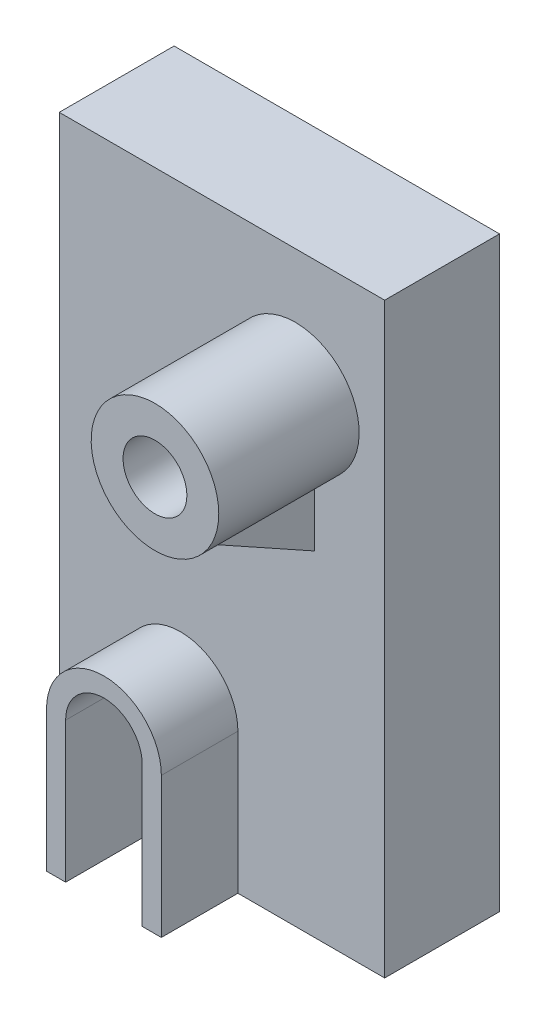
ISO-10303-21;
HEADER;
FILE_DESCRIPTION(('STEP AP214'),'2;1');
FILE_NAME('part.step','',(''),(''),'','','');
FILE_SCHEMA(('AUTOMOTIVE_DESIGN { 1 0 10303 214 1 1 1 1 }'));
ENDSEC;
DATA;
#1=APPLICATION_CONTEXT('core data for automotive mechanical design processes');
#2=APPLICATION_PROTOCOL_DEFINITION('international standard','automotive_design',2000,#1);
#3=PRODUCT_CONTEXT('',#1,'mechanical');
#4=PRODUCT('Part','Part','',(#3));
#5=PRODUCT_RELATED_PRODUCT_CATEGORY('part','',(#4));
#6=PRODUCT_DEFINITION_FORMATION('','',#4);
#7=PRODUCT_DEFINITION_CONTEXT('part definition',#1,'design');
#8=PRODUCT_DEFINITION('design','',#6,#7);
#9=PRODUCT_DEFINITION_SHAPE('','',#8);
#10=(LENGTH_UNIT() NAMED_UNIT(*) SI_UNIT(.MILLI.,.METRE.));
#11=(NAMED_UNIT(*) PLANE_ANGLE_UNIT() SI_UNIT($,.RADIAN.));
#12=(NAMED_UNIT(*) SI_UNIT($,.STERADIAN.) SOLID_ANGLE_UNIT());
#13=UNCERTAINTY_MEASURE_WITH_UNIT(LENGTH_MEASURE(1.E-05),#10,'distance_accuracy_value','');
#14=(GEOMETRIC_REPRESENTATION_CONTEXT(3) GLOBAL_UNCERTAINTY_ASSIGNED_CONTEXT((#13)) GLOBAL_UNIT_ASSIGNED_CONTEXT((#10,
#11,#12)) REPRESENTATION_CONTEXT('',''));
#15=CARTESIAN_POINT('',(0.,0.,0.));
#16=DIRECTION('',(0.,0.,1.));
#17=DIRECTION('',(1.,0.,0.));
#18=AXIS2_PLACEMENT_3D('',#15,#16,#17);
#19=CARTESIAN_POINT('',(0.,0.,18.));
#20=DIRECTION('',(0.,1.,0.));
#21=DIRECTION('',(0.,0.,1.));
#22=AXIS2_PLACEMENT_3D('',#19,#20,#21);
#23=PLANE('',#22);
#24=DIRECTION('',(1.,0.,0.));
#25=VECTOR('',#24,1.);
#26=CARTESIAN_POINT('',(0.,0.,0.));
#27=LINE('',#26,#25);
#28=CARTESIAN_POINT('',(25.,0.,0.));
#29=VERTEX_POINT('',#28);
#30=CARTESIAN_POINT('',(51.,0.,0.));
#31=VERTEX_POINT('',#30);
#32=EDGE_CURVE('E126',#29,#31,#27,.T.);
#33=ORIENTED_EDGE('',*,*,#32,.T.);
#34=DIRECTION('',(0.,0.,-1.));
#35=VECTOR('',#34,1.);
#36=CARTESIAN_POINT('',(51.,0.,18.));
#37=LINE('',#36,#35);
#38=CARTESIAN_POINT('',(51.,0.,18.));
#39=VERTEX_POINT('',#38);
#40=EDGE_CURVE('E11',#39,#31,#37,.T.);
#41=ORIENTED_EDGE('',*,*,#40,.F.);
#42=DIRECTION('',(1.,0.,0.));
#43=VECTOR('',#42,1.);
#44=CARTESIAN_POINT('',(0.,0.,18.));
#45=LINE('',#44,#43);
#46=CARTESIAN_POINT('',(28.,0.,18.));
#47=VERTEX_POINT('',#46);
#48=EDGE_CURVE('E195',#47,#39,#45,.T.);
#49=ORIENTED_EDGE('',*,*,#48,.F.);
#50=DIRECTION('',(0.,0.,-1.));
#51=VECTOR('',#50,1.);
#52=CARTESIAN_POINT('',(28.,0.,30.));
#53=LINE('',#52,#51);
#54=CARTESIAN_POINT('',(28.,0.,30.));
#55=VERTEX_POINT('',#54);
#56=EDGE_CURVE('E307',#55,#47,#53,.T.);
#57=ORIENTED_EDGE('',*,*,#56,.F.);
#58=DIRECTION('',(1.,0.,0.));
#59=VECTOR('',#58,1.);
#60=CARTESIAN_POINT('',(0.,0.,30.));
#61=LINE('',#60,#59);
#62=CARTESIAN_POINT('',(25.,0.,30.));
#63=VERTEX_POINT('',#62);
#64=EDGE_CURVE('E305',#63,#55,#61,.T.);
#65=ORIENTED_EDGE('',*,*,#64,.F.);
#66=DIRECTION('',(0.,0.,-1.));
#67=VECTOR('',#66,1.);
#68=CARTESIAN_POINT('',(25.,0.,30.));
#69=LINE('',#68,#67);
#70=EDGE_CURVE('E203',#63,#29,#69,.T.);
#71=ORIENTED_EDGE('',*,*,#70,.T.);
#72=EDGE_LOOP('',(#33,#41,#49,#57,#65,#71));
#73=FACE_BOUND('',#72,.T.);
#74=ADVANCED_FACE('F41',(#73),#23,.F.);
#75=CARTESIAN_POINT('',(51.,0.,18.));
#76=DIRECTION('',(-1.,0.,0.));
#77=DIRECTION('',(0.,0.,1.));
#78=AXIS2_PLACEMENT_3D('',#75,#76,#77);
#79=PLANE('',#78);
#80=DIRECTION('',(0.,1.,0.));
#81=VECTOR('',#80,1.);
#82=CARTESIAN_POINT('',(51.,0.,0.));
#83=LINE('',#82,#81);
#84=CARTESIAN_POINT('',(51.,92.,0.));
#85=VERTEX_POINT('',#84);
#86=EDGE_CURVE('E129',#31,#85,#83,.T.);
#87=ORIENTED_EDGE('',*,*,#86,.T.);
#88=DIRECTION('',(0.,0.,-1.));
#89=VECTOR('',#88,1.);
#90=CARTESIAN_POINT('',(51.,92.,18.));
#91=LINE('',#90,#89);
#92=CARTESIAN_POINT('',(51.,92.,18.));
#93=VERTEX_POINT('',#92);
#94=EDGE_CURVE('E49',#93,#85,#91,.T.);
#95=ORIENTED_EDGE('',*,*,#94,.F.);
#96=DIRECTION('',(0.,1.,0.));
#97=VECTOR('',#96,1.);
#98=CARTESIAN_POINT('',(51.,0.,18.));
#99=LINE('',#98,#97);
#100=EDGE_CURVE('E121',#39,#93,#99,.T.);
#101=ORIENTED_EDGE('',*,*,#100,.F.);
#102=ORIENTED_EDGE('',*,*,#40,.T.);
#103=EDGE_LOOP('',(#87,#95,#101,#102));
#104=FACE_BOUND('',#103,.T.);
#105=ADVANCED_FACE('F144',(#104),#79,.F.);
#106=CARTESIAN_POINT('',(0.,92.,18.));
#107=DIRECTION('',(0.,1.,0.));
#108=DIRECTION('',(0.,0.,1.));
#109=AXIS2_PLACEMENT_3D('',#106,#107,#108);
#110=PLANE('',#109);
#111=DIRECTION('',(1.,0.,0.));
#112=VECTOR('',#111,1.);
#113=CARTESIAN_POINT('',(0.,92.,0.));
#114=LINE('',#113,#112);
#115=CARTESIAN_POINT('',(0.,92.,0.));
#116=VERTEX_POINT('',#115);
#117=EDGE_CURVE('E133',#116,#85,#114,.T.);
#118=ORIENTED_EDGE('',*,*,#117,.F.);
#119=DIRECTION('',(0.,0.,-1.));
#120=VECTOR('',#119,1.);
#121=CARTESIAN_POINT('',(0.,92.,18.));
#122=LINE('',#121,#120);
#123=CARTESIAN_POINT('',(0.,92.,18.));
#124=VERTEX_POINT('',#123);
#125=EDGE_CURVE('E75',#124,#116,#122,.T.);
#126=ORIENTED_EDGE('',*,*,#125,.F.);
#127=DIRECTION('',(1.,0.,0.));
#128=VECTOR('',#127,1.);
#129=CARTESIAN_POINT('',(0.,92.,18.));
#130=LINE('',#129,#128);
#131=EDGE_CURVE('E119',#124,#93,#130,.T.);
#132=ORIENTED_EDGE('',*,*,#131,.T.);
#133=ORIENTED_EDGE('',*,*,#94,.T.);
#134=EDGE_LOOP('',(#118,#126,#132,#133));
#135=FACE_BOUND('',#134,.T.);
#136=ADVANCED_FACE('F142',(#135),#110,.T.);
#137=CARTESIAN_POINT('',(0.,0.,18.));
#138=DIRECTION('',(-1.,0.,0.));
#139=DIRECTION('',(0.,0.,1.));
#140=AXIS2_PLACEMENT_3D('',#137,#138,#139);
#141=PLANE('',#140);
#142=DIRECTION('',(0.,1.,0.));
#143=VECTOR('',#142,1.);
#144=CARTESIAN_POINT('',(0.,0.,0.));
#145=LINE('',#144,#143);
#146=CARTESIAN_POINT('',(0.,0.,0.));
#147=VERTEX_POINT('',#146);
#148=EDGE_CURVE('E107',#147,#116,#145,.T.);
#149=ORIENTED_EDGE('',*,*,#148,.F.);
#150=DIRECTION('',(0.,0.,-1.));
#151=VECTOR('',#150,1.);
#152=CARTESIAN_POINT('',(0.,0.,18.));
#153=LINE('',#152,#151);
#154=CARTESIAN_POINT('',(0.,0.,18.));
#155=VERTEX_POINT('',#154);
#156=EDGE_CURVE('E83',#155,#147,#153,.T.);
#157=ORIENTED_EDGE('',*,*,#156,.F.);
#158=DIRECTION('',(0.,1.,0.));
#159=VECTOR('',#158,1.);
#160=CARTESIAN_POINT('',(0.,0.,18.));
#161=LINE('',#160,#159);
#162=EDGE_CURVE('E105',#155,#124,#161,.T.);
#163=ORIENTED_EDGE('',*,*,#162,.T.);
#164=ORIENTED_EDGE('',*,*,#125,.T.);
#165=EDGE_LOOP('',(#149,#157,#163,#164));
#166=FACE_BOUND('',#165,.T.);
#167=ADVANCED_FACE('F103',(#166),#141,.T.);
#168=CARTESIAN_POINT('',(0.,0.,18.));
#169=DIRECTION('',(0.,1.,0.));
#170=DIRECTION('',(0.,0.,1.));
#171=AXIS2_PLACEMENT_3D('',#168,#169,#170);
#172=PLANE('',#171);
#173=DIRECTION('',(1.,0.,0.));
#174=VECTOR('',#173,1.);
#175=CARTESIAN_POINT('',(0.,0.,0.));
#176=LINE('',#175,#174);
#177=CARTESIAN_POINT('',(13.,0.,0.));
#178=VERTEX_POINT('',#177);
#179=EDGE_CURVE('E137',#147,#178,#176,.T.);
#180=ORIENTED_EDGE('',*,*,#179,.T.);
#181=DIRECTION('',(0.,0.,-1.));
#182=VECTOR('',#181,1.);
#183=CARTESIAN_POINT('',(13.,0.,30.));
#184=LINE('',#183,#182);
#185=CARTESIAN_POINT('',(13.,0.,30.));
#186=VERTEX_POINT('',#185);
#187=EDGE_CURVE('E158',#186,#178,#184,.T.);
#188=ORIENTED_EDGE('',*,*,#187,.F.);
#189=DIRECTION('',(1.,0.,0.));
#190=VECTOR('',#189,1.);
#191=CARTESIAN_POINT('',(0.,0.,30.));
#192=LINE('',#191,#190);
#193=CARTESIAN_POINT('',(9.99999999999999,0.,30.));
#194=VERTEX_POINT('',#193);
#195=EDGE_CURVE('E297',#194,#186,#192,.T.);
#196=ORIENTED_EDGE('',*,*,#195,.F.);
#197=DIRECTION('',(0.,0.,-1.));
#198=VECTOR('',#197,1.);
#199=CARTESIAN_POINT('',(9.99999999999999,0.,30.));
#200=LINE('',#199,#198);
#201=CARTESIAN_POINT('',(9.99999999999999,0.,18.));
#202=VERTEX_POINT('',#201);
#203=EDGE_CURVE('E114',#194,#202,#200,.T.);
#204=ORIENTED_EDGE('',*,*,#203,.T.);
#205=DIRECTION('',(1.,0.,0.));
#206=VECTOR('',#205,1.);
#207=CARTESIAN_POINT('',(0.,0.,18.));
#208=LINE('',#207,#206);
#209=EDGE_CURVE('E110',#155,#202,#208,.T.);
#210=ORIENTED_EDGE('',*,*,#209,.F.);
#211=ORIENTED_EDGE('',*,*,#156,.T.);
#212=EDGE_LOOP('',(#180,#188,#196,#204,#210,#211));
#213=FACE_BOUND('',#212,.T.);
#214=ADVANCED_FACE('F111',(#213),#172,.F.);
#215=CARTESIAN_POINT('',(0.,0.,18.));
#216=DIRECTION('',(0.,0.,1.));
#217=DIRECTION('',(1.,0.,0.));
#218=AXIS2_PLACEMENT_3D('',#215,#216,#217);
#219=PLANE('',#218);
#220=DIRECTION('',(1.,0.,0.));
#221=VECTOR('',#220,1.);
#222=CARTESIAN_POINT('',(0.,52.4606079858305,18.));
#223=LINE('',#222,#221);
#224=CARTESIAN_POINT('',(34.,52.4606079858306,18.));
#225=VERTEX_POINT('',#224);
#226=CARTESIAN_POINT('',(40.,52.4606079858305,18.));
#227=VERTEX_POINT('',#226);
#228=EDGE_CURVE('E186',#225,#227,#223,.T.);
#229=ORIENTED_EDGE('',*,*,#228,.F.);
#230=DIRECTION('',(0.,1.,0.));
#231=VECTOR('',#230,1.);
#232=CARTESIAN_POINT('',(34.,0.,18.));
#233=LINE('',#232,#231);
#234=CARTESIAN_POINT('',(34.,62.4606079858305,18.));
#235=VERTEX_POINT('',#234);
#236=EDGE_CURVE('E189',#225,#235,#233,.T.);
#237=ORIENTED_EDGE('',*,*,#236,.T.);
#238=CARTESIAN_POINT('',(37.,72.,18.));
#239=DIRECTION('',(0.,0.,1.));
#240=DIRECTION('',(1.,0.,0.));
#241=AXIS2_PLACEMENT_3D('',#238,#239,#240);
#242=CIRCLE('',#241,10.);
#243=CARTESIAN_POINT('',(40.,62.4606079858305,18.));
#244=VERTEX_POINT('',#243);
#245=EDGE_CURVE('E138',#244,#235,#242,.T.);
#246=ORIENTED_EDGE('',*,*,#245,.F.);
#247=DIRECTION('',(0.,1.,0.));
#248=VECTOR('',#247,1.);
#249=CARTESIAN_POINT('',(40.,0.,18.));
#250=LINE('',#249,#248);
#251=EDGE_CURVE('E183',#227,#244,#250,.T.);
#252=ORIENTED_EDGE('',*,*,#251,.F.);
#253=EDGE_LOOP('',(#229,#237,#246,#252));
#254=FACE_BOUND('',#253,.T.);
#255=CARTESIAN_POINT('',(19.,22.,18.));
#256=DIRECTION('',(0.,0.,1.));
#257=DIRECTION('',(1.,0.,0.));
#258=AXIS2_PLACEMENT_3D('',#255,#256,#257);
#259=CIRCLE('',#258,9.00000000000001);
#260=CARTESIAN_POINT('',(28.,22.,18.));
#261=VERTEX_POINT('',#260);
#262=CARTESIAN_POINT('',(9.99999999999999,22.,18.));
#263=VERTEX_POINT('',#262);
#264=EDGE_CURVE('E88',#261,#263,#259,.T.);
#265=ORIENTED_EDGE('',*,*,#264,.F.);
#266=DIRECTION('',(0.,1.,0.));
#267=VECTOR('',#266,1.);
#268=CARTESIAN_POINT('',(28.,0.,18.));
#269=LINE('',#268,#267);
#270=EDGE_CURVE('E193',#47,#261,#269,.T.);
#271=ORIENTED_EDGE('',*,*,#270,.F.);
#272=ORIENTED_EDGE('',*,*,#48,.T.);
#273=ORIENTED_EDGE('',*,*,#100,.T.);
#274=ORIENTED_EDGE('',*,*,#131,.F.);
#275=ORIENTED_EDGE('',*,*,#162,.F.);
#276=ORIENTED_EDGE('',*,*,#209,.T.);
#277=DIRECTION('',(0.,1.,0.));
#278=VECTOR('',#277,1.);
#279=CARTESIAN_POINT('',(9.99999999999999,0.,18.));
#280=LINE('',#279,#278);
#281=EDGE_CURVE('E57',#202,#263,#280,.T.);
#282=ORIENTED_EDGE('',*,*,#281,.T.);
#283=EDGE_LOOP('',(#265,#271,#272,#273,#274,#275,#276,#282));
#284=FACE_BOUND('',#283,.T.);
#285=ADVANCED_FACE('F117',(#254,#284),#219,.T.);
#286=CARTESIAN_POINT('',(0.,0.,0.));
#287=DIRECTION('',(0.,0.,1.));
#288=DIRECTION('',(1.,0.,0.));
#289=AXIS2_PLACEMENT_3D('',#286,#287,#288);
#290=PLANE('',#289);
#291=ORIENTED_EDGE('',*,*,#32,.F.);
#292=DIRECTION('',(0.,1.,0.));
#293=VECTOR('',#292,1.);
#294=CARTESIAN_POINT('',(25.,0.,0.));
#295=LINE('',#294,#293);
#296=CARTESIAN_POINT('',(25.,22.,0.));
#297=VERTEX_POINT('',#296);
#298=EDGE_CURVE('E207',#29,#297,#295,.T.);
#299=ORIENTED_EDGE('',*,*,#298,.T.);
#300=CARTESIAN_POINT('',(19.,22.,0.));
#301=DIRECTION('',(0.,0.,1.));
#302=DIRECTION('',(1.,0.,0.));
#303=AXIS2_PLACEMENT_3D('',#300,#301,#302);
#304=CIRCLE('',#303,6.00000000000001);
#305=CARTESIAN_POINT('',(13.,22.,0.));
#306=VERTEX_POINT('',#305);
#307=EDGE_CURVE('E309',#297,#306,#304,.T.);
#308=ORIENTED_EDGE('',*,*,#307,.T.);
#309=DIRECTION('',(0.,1.,0.));
#310=VECTOR('',#309,1.);
#311=CARTESIAN_POINT('',(13.,0.,0.));
#312=LINE('',#311,#310);
#313=EDGE_CURVE('E154',#178,#306,#312,.T.);
#314=ORIENTED_EDGE('',*,*,#313,.F.);
#315=ORIENTED_EDGE('',*,*,#179,.F.);
#316=ORIENTED_EDGE('',*,*,#148,.T.);
#317=ORIENTED_EDGE('',*,*,#117,.T.);
#318=ORIENTED_EDGE('',*,*,#86,.F.);
#319=EDGE_LOOP('',(#291,#299,#308,#314,#315,#316,#317,#318));
#320=FACE_BOUND('',#319,.T.);
#321=CARTESIAN_POINT('',(37.,72.,0.));
#322=DIRECTION('',(0.,0.,1.));
#323=DIRECTION('',(1.,0.,0.));
#324=AXIS2_PLACEMENT_3D('',#321,#322,#323);
#325=CIRCLE('',#324,5.);
#326=CARTESIAN_POINT('',(42.,72.,0.));
#327=VERTEX_POINT('',#326);
#328=EDGE_CURVE('E280',#327,#327,#325,.T.);
#329=ORIENTED_EDGE('',*,*,#328,.T.);
#330=EDGE_LOOP('',(#329));
#331=FACE_BOUND('',#330,.T.);
#332=ADVANCED_FACE('F148',(#320,#331),#290,.F.);
#333=CARTESIAN_POINT('',(28.,0.,30.));
#334=DIRECTION('',(-1.,0.,0.));
#335=DIRECTION('',(0.,0.,1.));
#336=AXIS2_PLACEMENT_3D('',#333,#334,#335);
#337=PLANE('',#336);
#338=ORIENTED_EDGE('',*,*,#270,.T.);
#339=DIRECTION('',(0.,0.,-1.));
#340=VECTOR('',#339,1.);
#341=CARTESIAN_POINT('',(28.,22.,30.));
#342=LINE('',#341,#340);
#343=CARTESIAN_POINT('',(28.,22.,30.));
#344=VERTEX_POINT('',#343);
#345=EDGE_CURVE('E130',#344,#261,#342,.T.);
#346=ORIENTED_EDGE('',*,*,#345,.F.);
#347=DIRECTION('',(0.,1.,0.));
#348=VECTOR('',#347,1.);
#349=CARTESIAN_POINT('',(28.,0.,30.));
#350=LINE('',#349,#348);
#351=EDGE_CURVE('E289',#55,#344,#350,.T.);
#352=ORIENTED_EDGE('',*,*,#351,.F.);
#353=ORIENTED_EDGE('',*,*,#56,.T.);
#354=EDGE_LOOP('',(#338,#346,#352,#353));
#355=FACE_BOUND('',#354,.T.);
#356=ADVANCED_FACE('F315',(#355),#337,.F.);
#357=CARTESIAN_POINT('',(19.,22.,30.));
#358=DIRECTION('',(0.,0.,-1.));
#359=DIRECTION('',(-1.,0.,0.));
#360=AXIS2_PLACEMENT_3D('',#357,#358,#359);
#361=CYLINDRICAL_SURFACE('',#360,9.00000000000001);
#362=ORIENTED_EDGE('',*,*,#264,.T.);
#363=DIRECTION('',(0.,0.,-1.));
#364=VECTOR('',#363,1.);
#365=CARTESIAN_POINT('',(9.99999999999999,22.,30.));
#366=LINE('',#365,#364);
#367=CARTESIAN_POINT('',(9.99999999999999,22.,30.));
#368=VERTEX_POINT('',#367);
#369=EDGE_CURVE('E170',#368,#263,#366,.T.);
#370=ORIENTED_EDGE('',*,*,#369,.F.);
#371=CARTESIAN_POINT('',(19.,22.,30.));
#372=DIRECTION('',(0.,0.,1.));
#373=DIRECTION('',(1.,0.,0.));
#374=AXIS2_PLACEMENT_3D('',#371,#372,#373);
#375=CIRCLE('',#374,9.00000000000001);
#376=EDGE_CURVE('E292',#344,#368,#375,.T.);
#377=ORIENTED_EDGE('',*,*,#376,.F.);
#378=ORIENTED_EDGE('',*,*,#345,.T.);
#379=EDGE_LOOP('',(#362,#370,#377,#378));
#380=FACE_BOUND('',#379,.T.);
#381=ADVANCED_FACE('F353',(#380),#361,.T.);
#382=CARTESIAN_POINT('',(9.99999999999999,0.,30.));
#383=DIRECTION('',(-1.,0.,0.));
#384=DIRECTION('',(0.,0.,1.));
#385=AXIS2_PLACEMENT_3D('',#382,#383,#384);
#386=PLANE('',#385);
#387=ORIENTED_EDGE('',*,*,#369,.T.);
#388=ORIENTED_EDGE('',*,*,#281,.F.);
#389=ORIENTED_EDGE('',*,*,#203,.F.);
#390=DIRECTION('',(0.,1.,0.));
#391=VECTOR('',#390,1.);
#392=CARTESIAN_POINT('',(9.99999999999999,0.,30.));
#393=LINE('',#392,#391);
#394=EDGE_CURVE('E294',#194,#368,#393,.T.);
#395=ORIENTED_EDGE('',*,*,#394,.T.);
#396=EDGE_LOOP('',(#387,#388,#389,#395));
#397=FACE_BOUND('',#396,.T.);
#398=ADVANCED_FACE('F356',(#397),#386,.T.);
#399=CARTESIAN_POINT('',(13.,0.,30.));
#400=DIRECTION('',(-1.,0.,0.));
#401=DIRECTION('',(0.,0.,1.));
#402=AXIS2_PLACEMENT_3D('',#399,#400,#401);
#403=PLANE('',#402);
#404=ORIENTED_EDGE('',*,*,#313,.T.);
#405=DIRECTION('',(0.,0.,-1.));
#406=VECTOR('',#405,1.);
#407=CARTESIAN_POINT('',(13.,22.,30.));
#408=LINE('',#407,#406);
#409=CARTESIAN_POINT('',(13.,22.,30.));
#410=VERTEX_POINT('',#409);
#411=EDGE_CURVE('E168',#410,#306,#408,.T.);
#412=ORIENTED_EDGE('',*,*,#411,.F.);
#413=DIRECTION('',(0.,1.,0.));
#414=VECTOR('',#413,1.);
#415=CARTESIAN_POINT('',(13.,0.,30.));
#416=LINE('',#415,#414);
#417=EDGE_CURVE('E167',#186,#410,#416,.T.);
#418=ORIENTED_EDGE('',*,*,#417,.F.);
#419=ORIENTED_EDGE('',*,*,#187,.T.);
#420=EDGE_LOOP('',(#404,#412,#418,#419));
#421=FACE_BOUND('',#420,.T.);
#422=ADVANCED_FACE('F164',(#421),#403,.F.);
#423=CARTESIAN_POINT('',(19.,22.,30.));
#424=DIRECTION('',(0.,0.,-1.));
#425=DIRECTION('',(-1.,0.,0.));
#426=AXIS2_PLACEMENT_3D('',#423,#424,#425);
#427=CYLINDRICAL_SURFACE('',#426,6.00000000000001);
#428=ORIENTED_EDGE('',*,*,#307,.F.);
#429=DIRECTION('',(0.,0.,-1.));
#430=VECTOR('',#429,1.);
#431=CARTESIAN_POINT('',(25.,22.,30.));
#432=LINE('',#431,#430);
#433=CARTESIAN_POINT('',(25.,22.,30.));
#434=VERTEX_POINT('',#433);
#435=EDGE_CURVE('E173',#434,#297,#432,.T.);
#436=ORIENTED_EDGE('',*,*,#435,.F.);
#437=CARTESIAN_POINT('',(19.,22.,30.));
#438=DIRECTION('',(0.,0.,1.));
#439=DIRECTION('',(1.,0.,0.));
#440=AXIS2_PLACEMENT_3D('',#437,#438,#439);
#441=CIRCLE('',#440,6.00000000000001);
#442=EDGE_CURVE('E300',#434,#410,#441,.T.);
#443=ORIENTED_EDGE('',*,*,#442,.T.);
#444=ORIENTED_EDGE('',*,*,#411,.T.);
#445=EDGE_LOOP('',(#428,#436,#443,#444));
#446=FACE_BOUND('',#445,.T.);
#447=ADVANCED_FACE('F323',(#446),#427,.F.);
#448=CARTESIAN_POINT('',(25.,0.,30.));
#449=DIRECTION('',(-1.,0.,0.));
#450=DIRECTION('',(0.,0.,1.));
#451=AXIS2_PLACEMENT_3D('',#448,#449,#450);
#452=PLANE('',#451);
#453=ORIENTED_EDGE('',*,*,#298,.F.);
#454=ORIENTED_EDGE('',*,*,#70,.F.);
#455=DIRECTION('',(0.,1.,0.));
#456=VECTOR('',#455,1.);
#457=CARTESIAN_POINT('',(25.,0.,30.));
#458=LINE('',#457,#456);
#459=EDGE_CURVE('E303',#63,#434,#458,.T.);
#460=ORIENTED_EDGE('',*,*,#459,.T.);
#461=ORIENTED_EDGE('',*,*,#435,.T.);
#462=EDGE_LOOP('',(#453,#454,#460,#461));
#463=FACE_BOUND('',#462,.T.);
#464=ADVANCED_FACE('F321',(#463),#452,.T.);
#465=CARTESIAN_POINT('',(0.,0.,30.));
#466=DIRECTION('',(0.,0.,1.));
#467=DIRECTION('',(1.,0.,0.));
#468=AXIS2_PLACEMENT_3D('',#465,#466,#467);
#469=PLANE('',#468);
#470=ORIENTED_EDGE('',*,*,#351,.T.);
#471=ORIENTED_EDGE('',*,*,#376,.T.);
#472=ORIENTED_EDGE('',*,*,#394,.F.);
#473=ORIENTED_EDGE('',*,*,#195,.T.);
#474=ORIENTED_EDGE('',*,*,#417,.T.);
#475=ORIENTED_EDGE('',*,*,#442,.F.);
#476=ORIENTED_EDGE('',*,*,#459,.F.);
#477=ORIENTED_EDGE('',*,*,#64,.T.);
#478=EDGE_LOOP('',(#470,#471,#472,#473,#474,#475,#476,#477));
#479=FACE_BOUND('',#478,.T.);
#480=ADVANCED_FACE('F320',(#479),#469,.T.);
#481=CARTESIAN_POINT('',(37.,72.,40.));
#482=DIRECTION('',(0.,0.,-1.));
#483=DIRECTION('',(-1.,0.,0.));
#484=AXIS2_PLACEMENT_3D('',#481,#482,#483);
#485=CYLINDRICAL_SURFACE('',#484,5.);
#486=CARTESIAN_POINT('',(37.,72.,40.));
#487=DIRECTION('',(0.,0.,1.));
#488=DIRECTION('',(1.,0.,0.));
#489=AXIS2_PLACEMENT_3D('',#486,#487,#488);
#490=CIRCLE('',#489,5.);
#491=CARTESIAN_POINT('',(42.,72.,40.));
#492=VERTEX_POINT('',#491);
#493=EDGE_CURVE('E281',#492,#492,#490,.T.);
#494=ORIENTED_EDGE('',*,*,#493,.T.);
#495=EDGE_LOOP('',(#494));
#496=FACE_BOUND('',#495,.T.);
#497=ORIENTED_EDGE('',*,*,#328,.F.);
#498=EDGE_LOOP('',(#497));
#499=FACE_BOUND('',#498,.T.);
#500=ADVANCED_FACE('F329',(#496,#499),#485,.F.);
#501=CARTESIAN_POINT('',(37.,72.,40.));
#502=DIRECTION('',(0.,0.,-1.));
#503=DIRECTION('',(-1.,0.,0.));
#504=AXIS2_PLACEMENT_3D('',#501,#502,#503);
#505=CYLINDRICAL_SURFACE('',#504,10.);
#506=ORIENTED_EDGE('',*,*,#245,.T.);
#507=DIRECTION('',(0.,0.,-1.));
#508=VECTOR('',#507,1.);
#509=CARTESIAN_POINT('',(34.,62.4606079858305,36.));
#510=LINE('',#509,#508);
#511=CARTESIAN_POINT('',(34.,62.4606079858306,36.));
#512=VERTEX_POINT('',#511);
#513=EDGE_CURVE('E271',#512,#235,#510,.T.);
#514=ORIENTED_EDGE('',*,*,#513,.F.);
#515=CARTESIAN_POINT('',(37.,72.,36.));
#516=DIRECTION('',(0.,0.,1.));
#517=DIRECTION('',(1.,0.,0.));
#518=AXIS2_PLACEMENT_3D('',#515,#516,#517);
#519=CIRCLE('',#518,10.);
#520=CARTESIAN_POINT('',(40.,62.4606079858305,36.));
#521=VERTEX_POINT('',#520);
#522=EDGE_CURVE('E253',#512,#521,#519,.T.);
#523=ORIENTED_EDGE('',*,*,#522,.T.);
#524=DIRECTION('',(0.,0.,-1.));
#525=VECTOR('',#524,1.);
#526=CARTESIAN_POINT('',(40.,62.4606079858305,36.));
#527=LINE('',#526,#525);
#528=EDGE_CURVE('E267',#521,#244,#527,.T.);
#529=ORIENTED_EDGE('',*,*,#528,.T.);
#530=EDGE_LOOP('',(#506,#514,#523,#529));
#531=FACE_BOUND('',#530,.T.);
#532=CARTESIAN_POINT('',(37.,72.,40.));
#533=DIRECTION('',(0.,0.,1.));
#534=DIRECTION('',(1.,0.,0.));
#535=AXIS2_PLACEMENT_3D('',#532,#533,#534);
#536=CIRCLE('',#535,10.);
#537=CARTESIAN_POINT('',(47.,72.,40.));
#538=VERTEX_POINT('',#537);
#539=EDGE_CURVE('E284',#538,#538,#536,.T.);
#540=ORIENTED_EDGE('',*,*,#539,.F.);
#541=EDGE_LOOP('',(#540));
#542=FACE_BOUND('',#541,.T.);
#543=ADVANCED_FACE('F274',(#531,#542),#505,.T.);
#544=CARTESIAN_POINT('',(0.,0.,40.));
#545=DIRECTION('',(0.,0.,1.));
#546=DIRECTION('',(1.,0.,0.));
#547=AXIS2_PLACEMENT_3D('',#544,#545,#546);
#548=PLANE('',#547);
#549=ORIENTED_EDGE('',*,*,#493,.F.);
#550=EDGE_LOOP('',(#549));
#551=FACE_BOUND('',#550,.T.);
#552=ORIENTED_EDGE('',*,*,#539,.T.);
#553=EDGE_LOOP('',(#552));
#554=FACE_BOUND('',#553,.T.);
#555=ADVANCED_FACE('F397',(#551,#554),#548,.T.);
#556=CARTESIAN_POINT('',(34.,0.,36.));
#557=DIRECTION('',(-1.,0.,0.));
#558=DIRECTION('',(0.,0.,1.));
#559=AXIS2_PLACEMENT_3D('',#556,#557,#558);
#560=PLANE('',#559);
#561=DIRECTION('',(0.,-0.485642931178632,-0.874157276121538));
#562=VECTOR('',#561,1.);
#563=CARTESIAN_POINT('',(34.,47.7293325174743,9.48370415695873));
#564=LINE('',#563,#562);
#565=EDGE_CURVE('E256',#512,#225,#564,.T.);
#566=ORIENTED_EDGE('',*,*,#565,.F.);
#567=ORIENTED_EDGE('',*,*,#513,.T.);
#568=ORIENTED_EDGE('',*,*,#236,.F.);
#569=EDGE_LOOP('',(#566,#567,#568));
#570=FACE_BOUND('',#569,.T.);
#571=ADVANCED_FACE('F402',(#570),#560,.T.);
#572=CARTESIAN_POINT('',(40.,0.,36.));
#573=DIRECTION('',(-1.,0.,0.));
#574=DIRECTION('',(0.,-1.,0.));
#575=AXIS2_PLACEMENT_3D('',#572,#573,#574);
#576=PLANE('',#575);
#577=ORIENTED_EDGE('',*,*,#528,.F.);
#578=DIRECTION('',(0.,0.485642931178632,0.874157276121538));
#579=VECTOR('',#578,1.);
#580=CARTESIAN_POINT('',(40.,62.4606079858305,36.));
#581=LINE('',#580,#579);
#582=EDGE_CURVE('E257',#227,#521,#581,.T.);
#583=ORIENTED_EDGE('',*,*,#582,.F.);
#584=ORIENTED_EDGE('',*,*,#251,.T.);
#585=EDGE_LOOP('',(#577,#583,#584));
#586=FACE_BOUND('',#585,.T.);
#587=ADVANCED_FACE('F268',(#586),#576,.F.);
#588=CARTESIAN_POINT('',(0.,62.4606079858306,36.));
#589=DIRECTION('',(0.,0.,1.));
#590=DIRECTION('',(1.,0.,0.));
#591=AXIS2_PLACEMENT_3D('',#588,#589,#590);
#592=PLANE('',#591);
#593=DIRECTION('',(1.,0.,0.));
#594=VECTOR('',#593,1.);
#595=CARTESIAN_POINT('',(0.,62.4606079858306,36.));
#596=LINE('',#595,#594);
#597=EDGE_CURVE('E249',#512,#521,#596,.T.);
#598=ORIENTED_EDGE('',*,*,#597,.T.);
#599=ORIENTED_EDGE('',*,*,#522,.F.);
#600=EDGE_LOOP('',(#598,#599));
#601=FACE_BOUND('',#600,.T.);
#602=ADVANCED_FACE('F251',(#601),#592,.F.);
#603=CARTESIAN_POINT('',(0.,62.4606079858306,36.));
#604=DIRECTION('',(0.,0.874157276121538,-0.485642931178632));
#605=DIRECTION('',(0.,0.485642931178632,0.874157276121538));
#606=AXIS2_PLACEMENT_3D('',#603,#604,#605);
#607=PLANE('',#606);
#608=ORIENTED_EDGE('',*,*,#565,.T.);
#609=ORIENTED_EDGE('',*,*,#228,.T.);
#610=ORIENTED_EDGE('',*,*,#582,.T.);
#611=ORIENTED_EDGE('',*,*,#597,.F.);
#612=EDGE_LOOP('',(#608,#609,#610,#611));
#613=FACE_BOUND('',#612,.T.);
#614=ADVANCED_FACE('F261',(#613),#607,.F.);
#615=CLOSED_SHELL('',(#74,#105,#136,#167,#214,#285,#332,#356,#381,#398,#422,#447,#464,#480,#500,
#543,#555,#571,#587,#602,#614));
#616=MANIFOLD_SOLID_BREP('B2',#615);
#617=ADVANCED_BREP_SHAPE_REPRESENTATION('',(#18,#616),#14);
#618=SHAPE_DEFINITION_REPRESENTATION(#9,#617);
ENDSEC;
END-ISO-10303-21;
